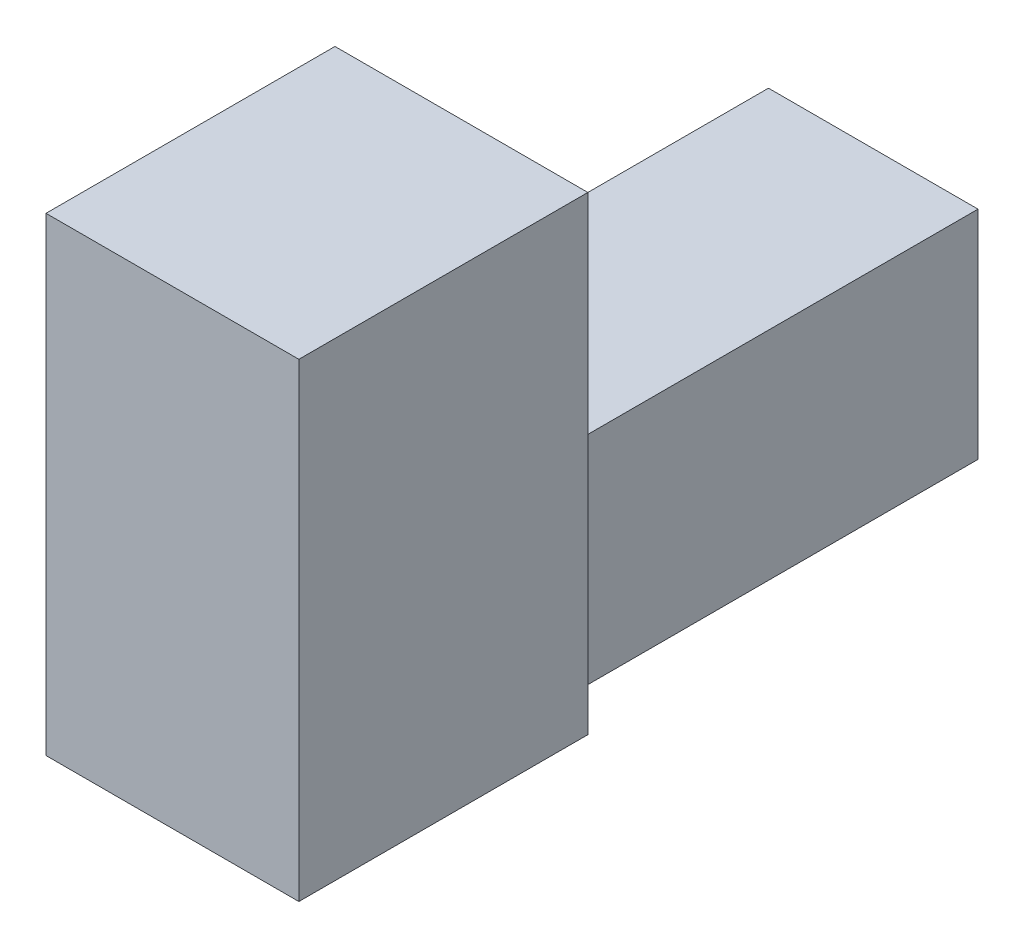
ISO-10303-21;
HEADER;
FILE_DESCRIPTION(('STEP AP214'),'2;1');
FILE_NAME('part.step','',(''),(''),'','','');
FILE_SCHEMA(('AUTOMOTIVE_DESIGN { 1 0 10303 214 1 1 1 1 }'));
ENDSEC;
DATA;
#1=APPLICATION_CONTEXT('core data for automotive mechanical design processes');
#2=APPLICATION_PROTOCOL_DEFINITION('international standard','automotive_design',2000,#1);
#3=PRODUCT_CONTEXT('',#1,'mechanical');
#4=PRODUCT('Part','Part','',(#3));
#5=PRODUCT_RELATED_PRODUCT_CATEGORY('part','',(#4));
#6=PRODUCT_DEFINITION_FORMATION('','',#4);
#7=PRODUCT_DEFINITION_CONTEXT('part definition',#1,'design');
#8=PRODUCT_DEFINITION('design','',#6,#7);
#9=PRODUCT_DEFINITION_SHAPE('','',#8);
#10=(LENGTH_UNIT() NAMED_UNIT(*) SI_UNIT(.MILLI.,.METRE.));
#11=(NAMED_UNIT(*) PLANE_ANGLE_UNIT() SI_UNIT($,.RADIAN.));
#12=(NAMED_UNIT(*) SI_UNIT($,.STERADIAN.) SOLID_ANGLE_UNIT());
#13=UNCERTAINTY_MEASURE_WITH_UNIT(LENGTH_MEASURE(1.E-05),#10,'distance_accuracy_value','');
#14=(GEOMETRIC_REPRESENTATION_CONTEXT(3) GLOBAL_UNCERTAINTY_ASSIGNED_CONTEXT((#13)) GLOBAL_UNIT_ASSIGNED_CONTEXT((#10,
#11,#12)) REPRESENTATION_CONTEXT('',''));
#15=CARTESIAN_POINT('',(0.,0.,0.));
#16=DIRECTION('',(0.,0.,1.));
#17=DIRECTION('',(1.,0.,0.));
#18=AXIS2_PLACEMENT_3D('',#15,#16,#17);
#19=CARTESIAN_POINT('',(35.,32.5,-50.));
#20=DIRECTION('',(0.,0.,1.));
#21=DIRECTION('',(0.,-1.,0.));
#22=AXIS2_PLACEMENT_3D('',#19,#20,#21);
#23=PLANE('',#22);
#24=DIRECTION('',(0.,1.,0.));
#25=VECTOR('',#24,1.);
#26=CARTESIAN_POINT('',(0.,32.5,-50.));
#27=LINE('',#26,#25);
#28=CARTESIAN_POINT('',(0.,-32.5,-50.));
#29=VERTEX_POINT('',#28);
#30=CARTESIAN_POINT('',(0.,-2.50000000000001,-50.));
#31=VERTEX_POINT('',#30);
#32=EDGE_CURVE('E73',#29,#31,#27,.T.);
#33=ORIENTED_EDGE('',*,*,#32,.T.);
#34=DIRECTION('',(1.,0.,0.));
#35=VECTOR('',#34,1.);
#36=CARTESIAN_POINT('',(0.,-2.50000000000001,-50.));
#37=LINE('',#36,#35);
#38=CARTESIAN_POINT('',(29.,-2.50000000000001,-50.));
#39=VERTEX_POINT('',#38);
#40=EDGE_CURVE('E107',#31,#39,#37,.T.);
#41=ORIENTED_EDGE('',*,*,#40,.T.);
#42=DIRECTION('',(0.,1.,0.));
#43=VECTOR('',#42,1.);
#44=CARTESIAN_POINT('',(29.,-32.5,-50.));
#45=LINE('',#44,#43);
#46=CARTESIAN_POINT('',(29.,-32.5,-50.));
#47=VERTEX_POINT('',#46);
#48=EDGE_CURVE('E75',#47,#39,#45,.T.);
#49=ORIENTED_EDGE('',*,*,#48,.F.);
#50=DIRECTION('',(-1.,0.,0.));
#51=VECTOR('',#50,1.);
#52=CARTESIAN_POINT('',(35.,-32.5,-50.));
#53=LINE('',#52,#51);
#54=EDGE_CURVE('E68',#47,#29,#53,.T.);
#55=ORIENTED_EDGE('',*,*,#54,.T.);
#56=EDGE_LOOP('',(#33,#41,#49,#55));
#57=FACE_BOUND('',#56,.T.);
#58=ADVANCED_FACE('F33',(#57),#23,.F.);
#59=CARTESIAN_POINT('',(35.,32.5,50.));
#60=DIRECTION('',(0.,-1.,0.));
#61=DIRECTION('',(0.,0.,-1.));
#62=AXIS2_PLACEMENT_3D('',#59,#60,#61);
#63=PLANE('',#62);
#64=DIRECTION('',(0.,0.,1.));
#65=VECTOR('',#64,1.);
#66=CARTESIAN_POINT('',(35.,32.5,50.));
#67=LINE('',#66,#65);
#68=CARTESIAN_POINT('',(35.,32.5,9.99999999999998));
#69=VERTEX_POINT('',#68);
#70=CARTESIAN_POINT('',(35.,32.5,50.));
#71=VERTEX_POINT('',#70);
#72=EDGE_CURVE('E85',#69,#71,#67,.T.);
#73=ORIENTED_EDGE('',*,*,#72,.F.);
#74=DIRECTION('',(1.,0.,0.));
#75=VECTOR('',#74,1.);
#76=CARTESIAN_POINT('',(0.,32.5,9.99999999999998));
#77=LINE('',#76,#75);
#78=CARTESIAN_POINT('',(0.,32.5,9.99999999999998));
#79=VERTEX_POINT('',#78);
#80=EDGE_CURVE('E117',#79,#69,#77,.T.);
#81=ORIENTED_EDGE('',*,*,#80,.F.);
#82=DIRECTION('',(0.,0.,1.));
#83=VECTOR('',#82,1.);
#84=CARTESIAN_POINT('',(0.,32.5,50.));
#85=LINE('',#84,#83);
#86=CARTESIAN_POINT('',(0.,32.5,50.));
#87=VERTEX_POINT('',#86);
#88=EDGE_CURVE('E92',#79,#87,#85,.T.);
#89=ORIENTED_EDGE('',*,*,#88,.T.);
#90=DIRECTION('',(-1.,0.,0.));
#91=VECTOR('',#90,1.);
#92=CARTESIAN_POINT('',(35.,32.5,50.));
#93=LINE('',#92,#91);
#94=EDGE_CURVE('E11',#71,#87,#93,.T.);
#95=ORIENTED_EDGE('',*,*,#94,.F.);
#96=EDGE_LOOP('',(#73,#81,#89,#95));
#97=FACE_BOUND('',#96,.T.);
#98=ADVANCED_FACE('F140',(#97),#63,.F.);
#99=CARTESIAN_POINT('',(35.,32.5,50.));
#100=DIRECTION('',(0.,0.,-1.));
#101=DIRECTION('',(0.,1.,0.));
#102=AXIS2_PLACEMENT_3D('',#99,#100,#101);
#103=PLANE('',#102);
#104=DIRECTION('',(0.,-1.,0.));
#105=VECTOR('',#104,1.);
#106=CARTESIAN_POINT('',(0.,32.5,50.));
#107=LINE('',#106,#105);
#108=CARTESIAN_POINT('',(0.,-32.5,50.));
#109=VERTEX_POINT('',#108);
#110=EDGE_CURVE('E61',#87,#109,#107,.T.);
#111=ORIENTED_EDGE('',*,*,#110,.T.);
#112=DIRECTION('',(-1.,0.,0.));
#113=VECTOR('',#112,1.);
#114=CARTESIAN_POINT('',(35.,-32.5,50.));
#115=LINE('',#114,#113);
#116=CARTESIAN_POINT('',(35.,-32.5,50.));
#117=VERTEX_POINT('',#116);
#118=EDGE_CURVE('E41',#117,#109,#115,.T.);
#119=ORIENTED_EDGE('',*,*,#118,.F.);
#120=DIRECTION('',(0.,-1.,0.));
#121=VECTOR('',#120,1.);
#122=CARTESIAN_POINT('',(35.,32.5,50.));
#123=LINE('',#122,#121);
#124=EDGE_CURVE('E49',#71,#117,#123,.T.);
#125=ORIENTED_EDGE('',*,*,#124,.F.);
#126=ORIENTED_EDGE('',*,*,#94,.T.);
#127=EDGE_LOOP('',(#111,#119,#125,#126));
#128=FACE_BOUND('',#127,.T.);
#129=ADVANCED_FACE('F171',(#128),#103,.F.);
#130=CARTESIAN_POINT('',(35.,-32.5,50.));
#131=DIRECTION('',(0.,1.,0.));
#132=DIRECTION('',(0.,0.,1.));
#133=AXIS2_PLACEMENT_3D('',#130,#131,#132);
#134=PLANE('',#133);
#135=DIRECTION('',(0.,0.,-1.));
#136=VECTOR('',#135,1.);
#137=CARTESIAN_POINT('',(29.,-32.5,-50.));
#138=LINE('',#137,#136);
#139=CARTESIAN_POINT('',(29.,-32.5,9.99999999999998));
#140=VERTEX_POINT('',#139);
#141=EDGE_CURVE('E97',#140,#47,#138,.T.);
#142=ORIENTED_EDGE('',*,*,#141,.F.);
#143=DIRECTION('',(1.,0.,0.));
#144=VECTOR('',#143,1.);
#145=CARTESIAN_POINT('',(29.,-32.5,9.99999999999998));
#146=LINE('',#145,#144);
#147=CARTESIAN_POINT('',(35.,-32.5,9.99999999999998));
#148=VERTEX_POINT('',#147);
#149=EDGE_CURVE('E93',#140,#148,#146,.T.);
#150=ORIENTED_EDGE('',*,*,#149,.T.);
#151=DIRECTION('',(0.,0.,-1.));
#152=VECTOR('',#151,1.);
#153=CARTESIAN_POINT('',(35.,-32.5,50.));
#154=LINE('',#153,#152);
#155=EDGE_CURVE('E78',#117,#148,#154,.T.);
#156=ORIENTED_EDGE('',*,*,#155,.F.);
#157=ORIENTED_EDGE('',*,*,#118,.T.);
#158=DIRECTION('',(0.,0.,-1.));
#159=VECTOR('',#158,1.);
#160=CARTESIAN_POINT('',(0.,-32.5,50.));
#161=LINE('',#160,#159);
#162=EDGE_CURVE('E81',#109,#29,#161,.T.);
#163=ORIENTED_EDGE('',*,*,#162,.T.);
#164=ORIENTED_EDGE('',*,*,#54,.F.);
#165=EDGE_LOOP('',(#142,#150,#156,#157,#163,#164));
#166=FACE_BOUND('',#165,.T.);
#167=ADVANCED_FACE('F82',(#166),#134,.F.);
#168=CARTESIAN_POINT('',(35.,0.,0.));
#169=DIRECTION('',(1.,0.,0.));
#170=DIRECTION('',(0.,0.,-1.));
#171=AXIS2_PLACEMENT_3D('',#168,#169,#170);
#172=PLANE('',#171);
#173=DIRECTION('',(0.,-1.,0.));
#174=VECTOR('',#173,1.);
#175=CARTESIAN_POINT('',(35.,-32.5,9.99999999999998));
#176=LINE('',#175,#174);
#177=EDGE_CURVE('E104',#69,#148,#176,.T.);
#178=ORIENTED_EDGE('',*,*,#177,.F.);
#179=ORIENTED_EDGE('',*,*,#72,.T.);
#180=ORIENTED_EDGE('',*,*,#124,.T.);
#181=ORIENTED_EDGE('',*,*,#155,.T.);
#182=EDGE_LOOP('',(#178,#179,#180,#181));
#183=FACE_BOUND('',#182,.T.);
#184=ADVANCED_FACE('F144',(#183),#172,.T.);
#185=CARTESIAN_POINT('',(0.,0.,0.));
#186=DIRECTION('',(1.,0.,0.));
#187=DIRECTION('',(0.,0.,-1.));
#188=AXIS2_PLACEMENT_3D('',#185,#186,#187);
#189=PLANE('',#188);
#190=DIRECTION('',(0.,-1.,0.));
#191=VECTOR('',#190,1.);
#192=CARTESIAN_POINT('',(0.,32.5,9.99999999999998));
#193=LINE('',#192,#191);
#194=CARTESIAN_POINT('',(0.,-2.50000000000002,9.99999999999998));
#195=VERTEX_POINT('',#194);
#196=EDGE_CURVE('E125',#79,#195,#193,.T.);
#197=ORIENTED_EDGE('',*,*,#196,.T.);
#198=DIRECTION('',(0.,0.,-1.));
#199=VECTOR('',#198,1.);
#200=CARTESIAN_POINT('',(0.,-2.50000000000001,-50.));
#201=LINE('',#200,#199);
#202=EDGE_CURVE('E91',#195,#31,#201,.T.);
#203=ORIENTED_EDGE('',*,*,#202,.T.);
#204=ORIENTED_EDGE('',*,*,#32,.F.);
#205=ORIENTED_EDGE('',*,*,#162,.F.);
#206=ORIENTED_EDGE('',*,*,#110,.F.);
#207=ORIENTED_EDGE('',*,*,#88,.F.);
#208=EDGE_LOOP('',(#197,#203,#204,#205,#206,#207));
#209=FACE_BOUND('',#208,.T.);
#210=ADVANCED_FACE('F89',(#209),#189,.F.);
#211=CARTESIAN_POINT('',(29.,-32.5,9.99999999999998));
#212=DIRECTION('',(0.,0.,1.));
#213=DIRECTION('',(1.,0.,0.));
#214=AXIS2_PLACEMENT_3D('',#211,#212,#213);
#215=PLANE('',#214);
#216=ORIENTED_EDGE('',*,*,#177,.T.);
#217=ORIENTED_EDGE('',*,*,#149,.F.);
#218=DIRECTION('',(0.,-1.,0.));
#219=VECTOR('',#218,1.);
#220=CARTESIAN_POINT('',(29.,-32.5,9.99999999999998));
#221=LINE('',#220,#219);
#222=CARTESIAN_POINT('',(29.,-2.50000000000001,9.99999999999998));
#223=VERTEX_POINT('',#222);
#224=EDGE_CURVE('E110',#223,#140,#221,.T.);
#225=ORIENTED_EDGE('',*,*,#224,.F.);
#226=DIRECTION('',(1.,0.,0.));
#227=VECTOR('',#226,1.);
#228=CARTESIAN_POINT('',(0.,-2.50000000000002,9.99999999999998));
#229=LINE('',#228,#227);
#230=EDGE_CURVE('E120',#195,#223,#229,.T.);
#231=ORIENTED_EDGE('',*,*,#230,.F.);
#232=ORIENTED_EDGE('',*,*,#196,.F.);
#233=ORIENTED_EDGE('',*,*,#80,.T.);
#234=EDGE_LOOP('',(#216,#217,#225,#231,#232,#233));
#235=FACE_BOUND('',#234,.T.);
#236=ADVANCED_FACE('F134',(#235),#215,.F.);
#237=CARTESIAN_POINT('',(29.,0.,0.));
#238=DIRECTION('',(1.,0.,0.));
#239=DIRECTION('',(0.,0.,-1.));
#240=AXIS2_PLACEMENT_3D('',#237,#238,#239);
#241=PLANE('',#240);
#242=ORIENTED_EDGE('',*,*,#48,.T.);
#243=DIRECTION('',(0.,0.,1.));
#244=VECTOR('',#243,1.);
#245=CARTESIAN_POINT('',(29.,-2.5,-50.));
#246=LINE('',#245,#244);
#247=EDGE_CURVE('E113',#39,#223,#246,.T.);
#248=ORIENTED_EDGE('',*,*,#247,.T.);
#249=ORIENTED_EDGE('',*,*,#224,.T.);
#250=ORIENTED_EDGE('',*,*,#141,.T.);
#251=EDGE_LOOP('',(#242,#248,#249,#250));
#252=FACE_BOUND('',#251,.T.);
#253=ADVANCED_FACE('F152',(#252),#241,.T.);
#254=CARTESIAN_POINT('',(0.,-2.50000000000001,-50.));
#255=DIRECTION('',(0.,-1.,0.));
#256=DIRECTION('',(0.,0.,-1.));
#257=AXIS2_PLACEMENT_3D('',#254,#255,#256);
#258=PLANE('',#257);
#259=ORIENTED_EDGE('',*,*,#247,.F.);
#260=ORIENTED_EDGE('',*,*,#40,.F.);
#261=ORIENTED_EDGE('',*,*,#202,.F.);
#262=ORIENTED_EDGE('',*,*,#230,.T.);
#263=EDGE_LOOP('',(#259,#260,#261,#262));
#264=FACE_BOUND('',#263,.T.);
#265=ADVANCED_FACE('F160',(#264),#258,.F.);
#266=CLOSED_SHELL('',(#58,#98,#129,#167,#184,#210,#236,#253,#265));
#267=MANIFOLD_SOLID_BREP('B2',#266);
#268=ADVANCED_BREP_SHAPE_REPRESENTATION('',(#18,#267),#14);
#269=SHAPE_DEFINITION_REPRESENTATION(#9,#268);
ENDSEC;
END-ISO-10303-21;
